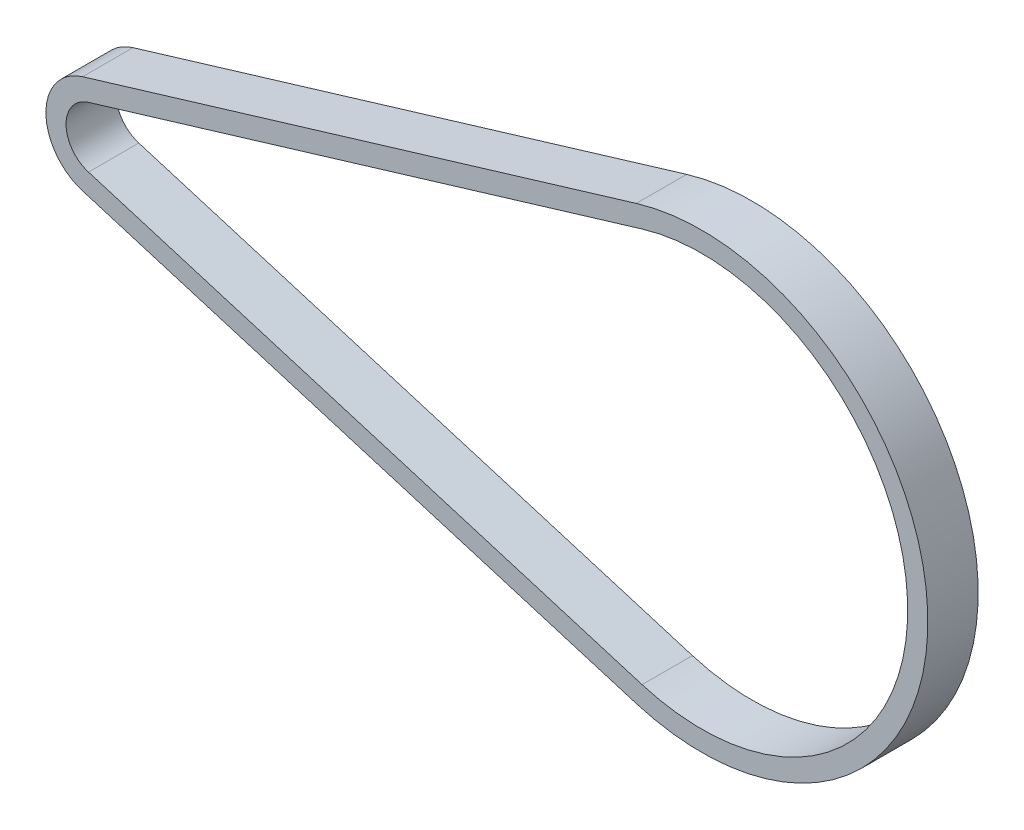
ISO-10303-21;
HEADER;
FILE_DESCRIPTION(('STEP AP214'),'2;1');
FILE_NAME('part.step','',(''),(''),'','','');
FILE_SCHEMA(('AUTOMOTIVE_DESIGN { 1 0 10303 214 1 1 1 1 }'));
ENDSEC;
DATA;
#1=APPLICATION_CONTEXT('core data for automotive mechanical design processes');
#2=APPLICATION_PROTOCOL_DEFINITION('international standard','automotive_design',2000,#1);
#3=PRODUCT_CONTEXT('',#1,'mechanical');
#4=PRODUCT('Part','Part','',(#3));
#5=PRODUCT_RELATED_PRODUCT_CATEGORY('part','',(#4));
#6=PRODUCT_DEFINITION_FORMATION('','',#4);
#7=PRODUCT_DEFINITION_CONTEXT('part definition',#1,'design');
#8=PRODUCT_DEFINITION('design','',#6,#7);
#9=PRODUCT_DEFINITION_SHAPE('','',#8);
#10=(LENGTH_UNIT() NAMED_UNIT(*) SI_UNIT(.MILLI.,.METRE.));
#11=(NAMED_UNIT(*) PLANE_ANGLE_UNIT() SI_UNIT($,.RADIAN.));
#12=(NAMED_UNIT(*) SI_UNIT($,.STERADIAN.) SOLID_ANGLE_UNIT());
#13=UNCERTAINTY_MEASURE_WITH_UNIT(LENGTH_MEASURE(1.E-05),#10,'distance_accuracy_value','');
#14=(GEOMETRIC_REPRESENTATION_CONTEXT(3) GLOBAL_UNCERTAINTY_ASSIGNED_CONTEXT((#13)) GLOBAL_UNIT_ASSIGNED_CONTEXT((#10,
#11,#12)) REPRESENTATION_CONTEXT('',''));
#15=CARTESIAN_POINT('',(0.,0.,0.));
#16=DIRECTION('',(0.,0.,1.));
#17=DIRECTION('',(1.,0.,0.));
#18=AXIS2_PLACEMENT_3D('',#15,#16,#17);
#19=CARTESIAN_POINT('',(279.559683817221,0.,25.));
#20=DIRECTION('',(0.,0.,1.));
#21=DIRECTION('',(1.,0.,0.));
#22=AXIS2_PLACEMENT_3D('',#19,#20,#21);
#23=PLANE('',#22);
#24=CARTESIAN_POINT('',(279.559683817221,0.,25.));
#25=DIRECTION('',(0.,0.,1.));
#26=DIRECTION('',(1.,0.,0.));
#27=AXIS2_PLACEMENT_3D('',#24,#25,#26);
#28=CIRCLE('',#27,112.35);
#29=CARTESIAN_POINT('',(247.097384093889,-107.557991784305,25.));
#30=VERTEX_POINT('',#29);
#31=CARTESIAN_POINT('',(247.097384093889,107.557991784305,25.));
#32=VERTEX_POINT('',#31);
#33=EDGE_CURVE('E166',#30,#32,#28,.T.);
#34=ORIENTED_EDGE('',*,*,#33,.T.);
#35=DIRECTION('',(-0.957347501417932,-0.28893902735498,0.));
#36=VECTOR('',#35,1.);
#37=CARTESIAN_POINT('',(-27.8568874474587,24.5734750141793,25.));
#38=LINE('',#37,#36);
#39=CARTESIAN_POINT('',(-27.8568874474587,24.5734750141793,25.));
#40=VERTEX_POINT('',#39);
#41=EDGE_CURVE('E169',#32,#40,#38,.T.);
#42=ORIENTED_EDGE('',*,*,#41,.T.);
#43=CARTESIAN_POINT('',(-20.4403161827792,0.,25.));
#44=DIRECTION('',(0.,0.,1.));
#45=DIRECTION('',(1.,0.,0.));
#46=AXIS2_PLACEMENT_3D('',#43,#44,#45);
#47=CIRCLE('',#46,25.668291793506);
#48=CARTESIAN_POINT('',(-27.8568874474588,-24.5734750141793,25.));
#49=VERTEX_POINT('',#48);
#50=EDGE_CURVE('E172',#40,#49,#47,.T.);
#51=ORIENTED_EDGE('',*,*,#50,.T.);
#52=DIRECTION('',(0.957347501417932,-0.28893902735498,0.));
#53=VECTOR('',#52,1.);
#54=CARTESIAN_POINT('',(-27.8568874474587,-24.5734750141793,25.));
#55=LINE('',#54,#53);
#56=EDGE_CURVE('E174',#49,#30,#55,.T.);
#57=ORIENTED_EDGE('',*,*,#56,.T.);
#58=EDGE_LOOP('',(#34,#42,#51,#57));
#59=FACE_BOUND('',#58,.T.);
#60=DIRECTION('',(-0.957347501417932,-0.28893902735498,0.));
#61=VECTOR('',#60,1.);
#62=CARTESIAN_POINT('',(-24.9674971739089,15.,25.));
#63=LINE('',#62,#61);
#64=CARTESIAN_POINT('',(249.986774367439,97.9845167701254,25.));
#65=VERTEX_POINT('',#64);
#66=CARTESIAN_POINT('',(-24.9674971739089,15.,25.));
#67=VERTEX_POINT('',#66);
#68=EDGE_CURVE('E138',#65,#67,#63,.T.);
#69=ORIENTED_EDGE('',*,*,#68,.F.);
#70=CARTESIAN_POINT('',(279.559683817221,0.,25.));
#71=DIRECTION('',(0.,0.,1.));
#72=DIRECTION('',(1.,0.,0.));
#73=AXIS2_PLACEMENT_3D('',#70,#71,#72);
#74=CIRCLE('',#73,102.35);
#75=CARTESIAN_POINT('',(249.986774367438,-97.9845167701254,25.));
#76=VERTEX_POINT('',#75);
#77=EDGE_CURVE('E130',#76,#65,#74,.T.);
#78=ORIENTED_EDGE('',*,*,#77,.F.);
#79=DIRECTION('',(0.957347501417932,-0.28893902735498,0.));
#80=VECTOR('',#79,1.);
#81=CARTESIAN_POINT('',(-24.9674971739089,-15.,25.));
#82=LINE('',#81,#80);
#83=CARTESIAN_POINT('',(-24.9674971739089,-15.,25.));
#84=VERTEX_POINT('',#83);
#85=EDGE_CURVE('E152',#84,#76,#82,.T.);
#86=ORIENTED_EDGE('',*,*,#85,.F.);
#87=CARTESIAN_POINT('',(-20.4403161827792,0.,25.));
#88=DIRECTION('',(0.,0.,1.));
#89=DIRECTION('',(-1.,0.,0.));
#90=AXIS2_PLACEMENT_3D('',#87,#88,#89);
#91=CIRCLE('',#90,15.668291793506);
#92=EDGE_CURVE('E150',#67,#84,#91,.T.);
#93=ORIENTED_EDGE('',*,*,#92,.F.);
#94=EDGE_LOOP('',(#69,#78,#86,#93));
#95=FACE_BOUND('',#94,.T.);
#96=ADVANCED_FACE('F65',(#59,#95),#23,.T.);
#97=CARTESIAN_POINT('',(279.559683817221,0.,0.));
#98=DIRECTION('',(0.,0.,1.));
#99=DIRECTION('',(1.,0.,0.));
#100=AXIS2_PLACEMENT_3D('',#97,#98,#99);
#101=PLANE('',#100);
#102=CARTESIAN_POINT('',(279.559683817221,0.,0.));
#103=DIRECTION('',(0.,0.,1.));
#104=DIRECTION('',(1.,0.,0.));
#105=AXIS2_PLACEMENT_3D('',#102,#103,#104);
#106=CIRCLE('',#105,112.35);
#107=CARTESIAN_POINT('',(247.097384093889,-107.557991784305,0.));
#108=VERTEX_POINT('',#107);
#109=CARTESIAN_POINT('',(247.097384093889,107.557991784305,0.));
#110=VERTEX_POINT('',#109);
#111=EDGE_CURVE('E146',#108,#110,#106,.T.);
#112=ORIENTED_EDGE('',*,*,#111,.F.);
#113=DIRECTION('',(0.957347501417932,-0.28893902735498,0.));
#114=VECTOR('',#113,1.);
#115=CARTESIAN_POINT('',(-27.8568874474587,-24.5734750141793,0.));
#116=LINE('',#115,#114);
#117=CARTESIAN_POINT('',(-27.8568874474588,-24.5734750141793,0.));
#118=VERTEX_POINT('',#117);
#119=EDGE_CURVE('E170',#118,#108,#116,.T.);
#120=ORIENTED_EDGE('',*,*,#119,.F.);
#121=CARTESIAN_POINT('',(-20.4403161827792,0.,0.));
#122=DIRECTION('',(0.,0.,1.));
#123=DIRECTION('',(1.,0.,0.));
#124=AXIS2_PLACEMENT_3D('',#121,#122,#123);
#125=CIRCLE('',#124,25.668291793506);
#126=CARTESIAN_POINT('',(-27.8568874474587,24.5734750141793,0.));
#127=VERTEX_POINT('',#126);
#128=EDGE_CURVE('E181',#127,#118,#125,.T.);
#129=ORIENTED_EDGE('',*,*,#128,.F.);
#130=DIRECTION('',(-0.957347501417932,-0.28893902735498,0.));
#131=VECTOR('',#130,1.);
#132=CARTESIAN_POINT('',(-27.8568874474587,24.5734750141793,0.));
#133=LINE('',#132,#131);
#134=EDGE_CURVE('E179',#110,#127,#133,.T.);
#135=ORIENTED_EDGE('',*,*,#134,.F.);
#136=EDGE_LOOP('',(#112,#120,#129,#135));
#137=FACE_BOUND('',#136,.T.);
#138=CARTESIAN_POINT('',(279.559683817221,0.,0.));
#139=DIRECTION('',(0.,0.,1.));
#140=DIRECTION('',(1.,0.,0.));
#141=AXIS2_PLACEMENT_3D('',#138,#139,#140);
#142=CIRCLE('',#141,102.35);
#143=CARTESIAN_POINT('',(249.986774367438,-97.9845167701254,0.));
#144=VERTEX_POINT('',#143);
#145=CARTESIAN_POINT('',(249.986774367439,97.9845167701254,0.));
#146=VERTEX_POINT('',#145);
#147=EDGE_CURVE('E88',#144,#146,#142,.T.);
#148=ORIENTED_EDGE('',*,*,#147,.T.);
#149=DIRECTION('',(-0.957347501417932,-0.28893902735498,0.));
#150=VECTOR('',#149,1.);
#151=CARTESIAN_POINT('',(-24.9674971739089,15.,0.));
#152=LINE('',#151,#150);
#153=CARTESIAN_POINT('',(-24.9674971739089,15.,0.));
#154=VERTEX_POINT('',#153);
#155=EDGE_CURVE('E145',#146,#154,#152,.T.);
#156=ORIENTED_EDGE('',*,*,#155,.T.);
#157=CARTESIAN_POINT('',(-20.4403161827792,0.,0.));
#158=DIRECTION('',(0.,0.,1.));
#159=DIRECTION('',(-1.,0.,0.));
#160=AXIS2_PLACEMENT_3D('',#157,#158,#159);
#161=CIRCLE('',#160,15.668291793506);
#162=CARTESIAN_POINT('',(-24.9674971739089,-15.,0.));
#163=VERTEX_POINT('',#162);
#164=EDGE_CURVE('E158',#154,#163,#161,.T.);
#165=ORIENTED_EDGE('',*,*,#164,.T.);
#166=DIRECTION('',(0.957347501417932,-0.28893902735498,0.));
#167=VECTOR('',#166,1.);
#168=CARTESIAN_POINT('',(-24.9674971739089,-15.,0.));
#169=LINE('',#168,#167);
#170=EDGE_CURVE('E139',#163,#144,#169,.T.);
#171=ORIENTED_EDGE('',*,*,#170,.T.);
#172=EDGE_LOOP('',(#148,#156,#165,#171));
#173=FACE_BOUND('',#172,.T.);
#174=ADVANCED_FACE('F199',(#137,#173),#101,.F.);
#175=CARTESIAN_POINT('',(279.559683817221,0.,25.));
#176=DIRECTION('',(0.,0.,-1.));
#177=DIRECTION('',(-1.,0.,0.));
#178=AXIS2_PLACEMENT_3D('',#175,#176,#177);
#179=CYLINDRICAL_SURFACE('',#178,112.35);
#180=ORIENTED_EDGE('',*,*,#111,.T.);
#181=DIRECTION('',(0.,0.,-1.));
#182=VECTOR('',#181,1.);
#183=CARTESIAN_POINT('',(247.097384093889,107.557991784305,25.));
#184=LINE('',#183,#182);
#185=EDGE_CURVE('E12',#32,#110,#184,.T.);
#186=ORIENTED_EDGE('',*,*,#185,.F.);
#187=ORIENTED_EDGE('',*,*,#33,.F.);
#188=DIRECTION('',(0.,0.,-1.));
#189=VECTOR('',#188,1.);
#190=CARTESIAN_POINT('',(247.097384093889,-107.557991784305,25.));
#191=LINE('',#190,#189);
#192=EDGE_CURVE('E176',#30,#108,#191,.T.);
#193=ORIENTED_EDGE('',*,*,#192,.T.);
#194=EDGE_LOOP('',(#180,#186,#187,#193));
#195=FACE_BOUND('',#194,.T.);
#196=ADVANCED_FACE('F67',(#195),#179,.T.);
#197=CARTESIAN_POINT('',(-27.8568874474587,24.5734750141793,25.));
#198=DIRECTION('',(0.28893902735498,-0.957347501417932,0.));
#199=DIRECTION('',(0.957347501417933,0.28893902735498,0.));
#200=AXIS2_PLACEMENT_3D('',#197,#198,#199);
#201=PLANE('',#200);
#202=ORIENTED_EDGE('',*,*,#134,.T.);
#203=DIRECTION('',(0.,0.,-1.));
#204=VECTOR('',#203,1.);
#205=CARTESIAN_POINT('',(-27.8568874474587,24.5734750141793,25.));
#206=LINE('',#205,#204);
#207=EDGE_CURVE('E73',#40,#127,#206,.T.);
#208=ORIENTED_EDGE('',*,*,#207,.F.);
#209=ORIENTED_EDGE('',*,*,#41,.F.);
#210=ORIENTED_EDGE('',*,*,#185,.T.);
#211=EDGE_LOOP('',(#202,#208,#209,#210));
#212=FACE_BOUND('',#211,.T.);
#213=ADVANCED_FACE('F209',(#212),#201,.F.);
#214=CARTESIAN_POINT('',(-20.4403161827792,0.,25.));
#215=DIRECTION('',(0.,0.,-1.));
#216=DIRECTION('',(-1.,0.,0.));
#217=AXIS2_PLACEMENT_3D('',#214,#215,#216);
#218=CYLINDRICAL_SURFACE('',#217,25.668291793506);
#219=ORIENTED_EDGE('',*,*,#128,.T.);
#220=DIRECTION('',(0.,0.,-1.));
#221=VECTOR('',#220,1.);
#222=CARTESIAN_POINT('',(-27.8568874474588,-24.5734750141793,25.));
#223=LINE('',#222,#221);
#224=EDGE_CURVE('E186',#49,#118,#223,.T.);
#225=ORIENTED_EDGE('',*,*,#224,.F.);
#226=ORIENTED_EDGE('',*,*,#50,.F.);
#227=ORIENTED_EDGE('',*,*,#207,.T.);
#228=EDGE_LOOP('',(#219,#225,#226,#227));
#229=FACE_BOUND('',#228,.T.);
#230=ADVANCED_FACE('F193',(#229),#218,.T.);
#231=CARTESIAN_POINT('',(-27.8568874474587,-24.5734750141793,25.));
#232=DIRECTION('',(0.28893902735498,0.957347501417932,0.));
#233=DIRECTION('',(-0.957347501417932,0.28893902735498,0.));
#234=AXIS2_PLACEMENT_3D('',#231,#232,#233);
#235=PLANE('',#234);
#236=ORIENTED_EDGE('',*,*,#119,.T.);
#237=ORIENTED_EDGE('',*,*,#192,.F.);
#238=ORIENTED_EDGE('',*,*,#56,.F.);
#239=ORIENTED_EDGE('',*,*,#224,.T.);
#240=EDGE_LOOP('',(#236,#237,#238,#239));
#241=FACE_BOUND('',#240,.T.);
#242=ADVANCED_FACE('F203',(#241),#235,.F.);
#243=CARTESIAN_POINT('',(279.559683817221,0.,25.));
#244=DIRECTION('',(0.,0.,-1.));
#245=DIRECTION('',(-1.,0.,0.));
#246=AXIS2_PLACEMENT_3D('',#243,#244,#245);
#247=CYLINDRICAL_SURFACE('',#246,102.35);
#248=ORIENTED_EDGE('',*,*,#147,.F.);
#249=DIRECTION('',(0.,0.,-1.));
#250=VECTOR('',#249,1.);
#251=CARTESIAN_POINT('',(249.986774367438,-97.9845167701254,25.));
#252=LINE('',#251,#250);
#253=EDGE_CURVE('E134',#76,#144,#252,.T.);
#254=ORIENTED_EDGE('',*,*,#253,.F.);
#255=ORIENTED_EDGE('',*,*,#77,.T.);
#256=DIRECTION('',(0.,0.,-1.));
#257=VECTOR('',#256,1.);
#258=CARTESIAN_POINT('',(249.986774367439,97.9845167701254,25.));
#259=LINE('',#258,#257);
#260=EDGE_CURVE('E133',#65,#146,#259,.T.);
#261=ORIENTED_EDGE('',*,*,#260,.T.);
#262=EDGE_LOOP('',(#248,#254,#255,#261));
#263=FACE_BOUND('',#262,.T.);
#264=ADVANCED_FACE('F132',(#263),#247,.F.);
#265=CARTESIAN_POINT('',(-24.9674971739089,15.,25.));
#266=DIRECTION('',(0.28893902735498,-0.957347501417932,0.));
#267=DIRECTION('',(0.957347501417932,0.28893902735498,0.));
#268=AXIS2_PLACEMENT_3D('',#265,#266,#267);
#269=PLANE('',#268);
#270=ORIENTED_EDGE('',*,*,#155,.F.);
#271=ORIENTED_EDGE('',*,*,#260,.F.);
#272=ORIENTED_EDGE('',*,*,#68,.T.);
#273=DIRECTION('',(0.,0.,-1.));
#274=VECTOR('',#273,1.);
#275=CARTESIAN_POINT('',(-24.9674971739089,15.,25.));
#276=LINE('',#275,#274);
#277=EDGE_CURVE('E147',#67,#154,#276,.T.);
#278=ORIENTED_EDGE('',*,*,#277,.T.);
#279=EDGE_LOOP('',(#270,#271,#272,#278));
#280=FACE_BOUND('',#279,.T.);
#281=ADVANCED_FACE('F142',(#280),#269,.T.);
#282=CARTESIAN_POINT('',(-20.4403161827792,0.,25.));
#283=DIRECTION('',(0.,0.,-1.));
#284=DIRECTION('',(-1.,0.,0.));
#285=AXIS2_PLACEMENT_3D('',#282,#283,#284);
#286=CYLINDRICAL_SURFACE('',#285,15.668291793506);
#287=ORIENTED_EDGE('',*,*,#164,.F.);
#288=ORIENTED_EDGE('',*,*,#277,.F.);
#289=ORIENTED_EDGE('',*,*,#92,.T.);
#290=DIRECTION('',(0.,0.,-1.));
#291=VECTOR('',#290,1.);
#292=CARTESIAN_POINT('',(-24.9674971739089,-15.,25.));
#293=LINE('',#292,#291);
#294=EDGE_CURVE('E80',#84,#163,#293,.T.);
#295=ORIENTED_EDGE('',*,*,#294,.T.);
#296=EDGE_LOOP('',(#287,#288,#289,#295));
#297=FACE_BOUND('',#296,.T.);
#298=ADVANCED_FACE('F232',(#297),#286,.F.);
#299=CARTESIAN_POINT('',(-24.9674971739089,-15.,25.));
#300=DIRECTION('',(0.28893902735498,0.957347501417932,0.));
#301=DIRECTION('',(-0.957347501417932,0.28893902735498,0.));
#302=AXIS2_PLACEMENT_3D('',#299,#300,#301);
#303=PLANE('',#302);
#304=ORIENTED_EDGE('',*,*,#170,.F.);
#305=ORIENTED_EDGE('',*,*,#294,.F.);
#306=ORIENTED_EDGE('',*,*,#85,.T.);
#307=ORIENTED_EDGE('',*,*,#253,.T.);
#308=EDGE_LOOP('',(#304,#305,#306,#307));
#309=FACE_BOUND('',#308,.T.);
#310=ADVANCED_FACE('F236',(#309),#303,.T.);
#311=CLOSED_SHELL('',(#96,#174,#196,#213,#230,#242,#264,#281,#298,#310));
#312=MANIFOLD_SOLID_BREP('B2',#311);
#313=ADVANCED_BREP_SHAPE_REPRESENTATION('',(#18,#312),#14);
#314=SHAPE_DEFINITION_REPRESENTATION(#9,#313);
ENDSEC;
END-ISO-10303-21;
